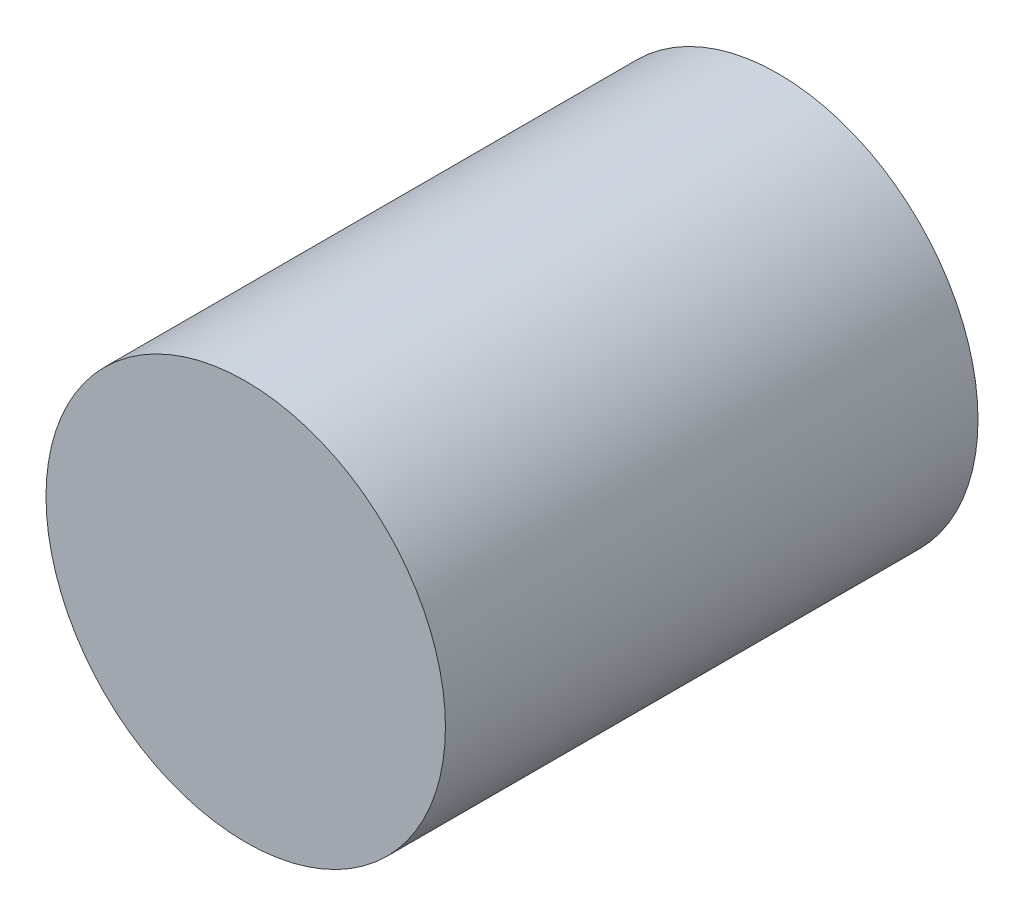
ISO-10303-21;
HEADER;
FILE_DESCRIPTION(('STEP AP214'),'2;1');
FILE_NAME('part.step','',(''),(''),'','','');
FILE_SCHEMA(('AUTOMOTIVE_DESIGN { 1 0 10303 214 1 1 1 1 }'));
ENDSEC;
DATA;
#1=APPLICATION_CONTEXT('core data for automotive mechanical design processes');
#2=APPLICATION_PROTOCOL_DEFINITION('international standard','automotive_design',2000,#1);
#3=PRODUCT_CONTEXT('',#1,'mechanical');
#4=PRODUCT('Part','Part','',(#3));
#5=PRODUCT_RELATED_PRODUCT_CATEGORY('part','',(#4));
#6=PRODUCT_DEFINITION_FORMATION('','',#4);
#7=PRODUCT_DEFINITION_CONTEXT('part definition',#1,'design');
#8=PRODUCT_DEFINITION('design','',#6,#7);
#9=PRODUCT_DEFINITION_SHAPE('','',#8);
#10=(LENGTH_UNIT() NAMED_UNIT(*) SI_UNIT(.MILLI.,.METRE.));
#11=(NAMED_UNIT(*) PLANE_ANGLE_UNIT() SI_UNIT($,.RADIAN.));
#12=(NAMED_UNIT(*) SI_UNIT($,.STERADIAN.) SOLID_ANGLE_UNIT());
#13=UNCERTAINTY_MEASURE_WITH_UNIT(LENGTH_MEASURE(1.E-05),#10,'distance_accuracy_value','');
#14=(GEOMETRIC_REPRESENTATION_CONTEXT(3) GLOBAL_UNCERTAINTY_ASSIGNED_CONTEXT((#13)) GLOBAL_UNIT_ASSIGNED_CONTEXT((#10,
#11,#12)) REPRESENTATION_CONTEXT('',''));
#15=CARTESIAN_POINT('',(0.,0.,0.));
#16=DIRECTION('',(0.,0.,1.));
#17=DIRECTION('',(1.,0.,0.));
#18=AXIS2_PLACEMENT_3D('',#15,#16,#17);
#19=CARTESIAN_POINT('',(0.,0.,10.));
#20=DIRECTION('',(0.,0.,-1.));
#21=DIRECTION('',(-1.,0.,0.));
#22=AXIS2_PLACEMENT_3D('',#19,#20,#21);
#23=CYLINDRICAL_SURFACE('',#22,7.5);
#24=CARTESIAN_POINT('',(0.,0.,10.));
#25=DIRECTION('',(0.,0.,1.));
#26=DIRECTION('',(1.,0.,0.));
#27=AXIS2_PLACEMENT_3D('',#24,#25,#26);
#28=CIRCLE('',#27,7.5);
#29=CARTESIAN_POINT('',(7.5,0.,10.));
#30=VERTEX_POINT('',#29);
#31=EDGE_CURVE('E10',#30,#30,#28,.T.);
#32=ORIENTED_EDGE('',*,*,#31,.F.);
#33=EDGE_LOOP('',(#32));
#34=FACE_BOUND('',#33,.T.);
#35=CARTESIAN_POINT('',(0.,0.,-10.));
#36=DIRECTION('',(0.,0.,1.));
#37=DIRECTION('',(1.,0.,0.));
#38=AXIS2_PLACEMENT_3D('',#35,#36,#37);
#39=CIRCLE('',#38,7.5);
#40=CARTESIAN_POINT('',(7.5,0.,-10.));
#41=VERTEX_POINT('',#40);
#42=EDGE_CURVE('E40',#41,#41,#39,.T.);
#43=ORIENTED_EDGE('',*,*,#42,.T.);
#44=EDGE_LOOP('',(#43));
#45=FACE_BOUND('',#44,.T.);
#46=ADVANCED_FACE('F37',(#34,#45),#23,.T.);
#47=CARTESIAN_POINT('',(0.,0.,10.));
#48=DIRECTION('',(0.,0.,1.));
#49=DIRECTION('',(1.,0.,0.));
#50=AXIS2_PLACEMENT_3D('',#47,#48,#49);
#51=PLANE('',#50);
#52=ORIENTED_EDGE('',*,*,#31,.T.);
#53=EDGE_LOOP('',(#52));
#54=FACE_BOUND('',#53,.T.);
#55=ADVANCED_FACE('F52',(#54),#51,.T.);
#56=CARTESIAN_POINT('',(0.,0.,-10.));
#57=DIRECTION('',(0.,0.,1.));
#58=DIRECTION('',(1.,0.,0.));
#59=AXIS2_PLACEMENT_3D('',#56,#57,#58);
#60=PLANE('',#59);
#61=ORIENTED_EDGE('',*,*,#42,.F.);
#62=EDGE_LOOP('',(#61));
#63=FACE_BOUND('',#62,.T.);
#64=ADVANCED_FACE('F50',(#63),#60,.F.);
#65=CLOSED_SHELL('',(#46,#55,#64));
#66=MANIFOLD_SOLID_BREP('B2',#65);
#67=ADVANCED_BREP_SHAPE_REPRESENTATION('',(#18,#66),#14);
#68=SHAPE_DEFINITION_REPRESENTATION(#9,#67);
ENDSEC;
END-ISO-10303-21;
